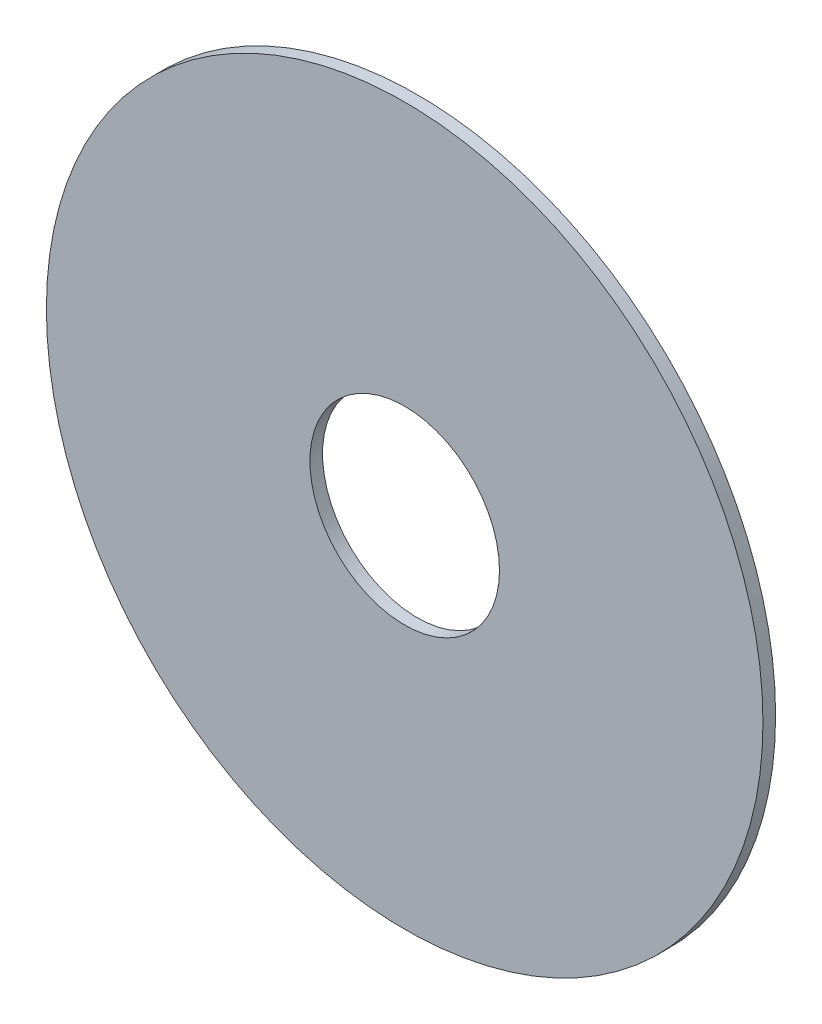
ISO-10303-21;
HEADER;
FILE_DESCRIPTION(('STEP AP214'),'2;1');
FILE_NAME('part.step','',(''),(''),'','','');
FILE_SCHEMA(('AUTOMOTIVE_DESIGN { 1 0 10303 214 1 1 1 1 }'));
ENDSEC;
DATA;
#1=APPLICATION_CONTEXT('core data for automotive mechanical design processes');
#2=APPLICATION_PROTOCOL_DEFINITION('international standard','automotive_design',2000,#1);
#3=PRODUCT_CONTEXT('',#1,'mechanical');
#4=PRODUCT('Part','Part','',(#3));
#5=PRODUCT_RELATED_PRODUCT_CATEGORY('part','',(#4));
#6=PRODUCT_DEFINITION_FORMATION('','',#4);
#7=PRODUCT_DEFINITION_CONTEXT('part definition',#1,'design');
#8=PRODUCT_DEFINITION('design','',#6,#7);
#9=PRODUCT_DEFINITION_SHAPE('','',#8);
#10=(LENGTH_UNIT() NAMED_UNIT(*) SI_UNIT(.MILLI.,.METRE.));
#11=(NAMED_UNIT(*) PLANE_ANGLE_UNIT() SI_UNIT($,.RADIAN.));
#12=(NAMED_UNIT(*) SI_UNIT($,.STERADIAN.) SOLID_ANGLE_UNIT());
#13=UNCERTAINTY_MEASURE_WITH_UNIT(LENGTH_MEASURE(1.E-05),#10,'distance_accuracy_value','');
#14=(GEOMETRIC_REPRESENTATION_CONTEXT(3) GLOBAL_UNCERTAINTY_ASSIGNED_CONTEXT((#13)) GLOBAL_UNIT_ASSIGNED_CONTEXT((#10,
#11,#12)) REPRESENTATION_CONTEXT('',''));
#15=CARTESIAN_POINT('',(0.,0.,0.));
#16=DIRECTION('',(0.,0.,1.));
#17=DIRECTION('',(1.,0.,0.));
#18=AXIS2_PLACEMENT_3D('',#15,#16,#17);
#19=CARTESIAN_POINT('',(0.,0.,1.));
#20=DIRECTION('',(0.,0.,1.));
#21=DIRECTION('',(1.,0.,0.));
#22=AXIS2_PLACEMENT_3D('',#19,#20,#21);
#23=PLANE('',#22);
#24=CARTESIAN_POINT('',(0.,0.,1.));
#25=DIRECTION('',(0.,0.,1.));
#26=DIRECTION('',(1.,0.,0.));
#27=AXIS2_PLACEMENT_3D('',#24,#25,#26);
#28=CIRCLE('',#27,28.35);
#29=CARTESIAN_POINT('',(28.35,0.,1.));
#30=VERTEX_POINT('',#29);
#31=EDGE_CURVE('E10',#30,#30,#28,.T.);
#32=ORIENTED_EDGE('',*,*,#31,.T.);
#33=EDGE_LOOP('',(#32));
#34=FACE_BOUND('',#33,.T.);
#35=CARTESIAN_POINT('',(0.,0.,1.));
#36=DIRECTION('',(0.,0.,1.));
#37=DIRECTION('',(1.,0.,0.));
#38=AXIS2_PLACEMENT_3D('',#35,#36,#37);
#39=CIRCLE('',#38,7.5);
#40=CARTESIAN_POINT('',(7.5,0.,1.));
#41=VERTEX_POINT('',#40);
#42=EDGE_CURVE('E42',#41,#41,#39,.T.);
#43=ORIENTED_EDGE('',*,*,#42,.F.);
#44=EDGE_LOOP('',(#43));
#45=FACE_BOUND('',#44,.T.);
#46=ADVANCED_FACE('F31',(#34,#45),#23,.T.);
#47=CARTESIAN_POINT('',(0.,0.,0.));
#48=DIRECTION('',(0.,0.,1.));
#49=DIRECTION('',(1.,0.,0.));
#50=AXIS2_PLACEMENT_3D('',#47,#48,#49);
#51=PLANE('',#50);
#52=CARTESIAN_POINT('',(0.,0.,0.));
#53=DIRECTION('',(0.,0.,1.));
#54=DIRECTION('',(1.,0.,0.));
#55=AXIS2_PLACEMENT_3D('',#52,#53,#54);
#56=CIRCLE('',#55,28.35);
#57=CARTESIAN_POINT('',(28.35,0.,0.));
#58=VERTEX_POINT('',#57);
#59=EDGE_CURVE('E35',#58,#58,#56,.T.);
#60=ORIENTED_EDGE('',*,*,#59,.F.);
#61=EDGE_LOOP('',(#60));
#62=FACE_BOUND('',#61,.T.);
#63=CARTESIAN_POINT('',(0.,0.,0.));
#64=DIRECTION('',(0.,0.,1.));
#65=DIRECTION('',(1.,0.,0.));
#66=AXIS2_PLACEMENT_3D('',#63,#64,#65);
#67=CIRCLE('',#66,7.5);
#68=CARTESIAN_POINT('',(7.5,0.,0.));
#69=VERTEX_POINT('',#68);
#70=EDGE_CURVE('E44',#69,#69,#67,.T.);
#71=ORIENTED_EDGE('',*,*,#70,.T.);
#72=EDGE_LOOP('',(#71));
#73=FACE_BOUND('',#72,.T.);
#74=ADVANCED_FACE('F54',(#62,#73),#51,.F.);
#75=CARTESIAN_POINT('',(0.,0.,1.));
#76=DIRECTION('',(0.,0.,-1.));
#77=DIRECTION('',(-1.,0.,0.));
#78=AXIS2_PLACEMENT_3D('',#75,#76,#77);
#79=CYLINDRICAL_SURFACE('',#78,28.35);
#80=ORIENTED_EDGE('',*,*,#31,.F.);
#81=EDGE_LOOP('',(#80));
#82=FACE_BOUND('',#81,.T.);
#83=ORIENTED_EDGE('',*,*,#59,.T.);
#84=EDGE_LOOP('',(#83));
#85=FACE_BOUND('',#84,.T.);
#86=ADVANCED_FACE('F33',(#82,#85),#79,.T.);
#87=CARTESIAN_POINT('',(0.,0.,1.));
#88=DIRECTION('',(0.,0.,-1.));
#89=DIRECTION('',(-1.,0.,0.));
#90=AXIS2_PLACEMENT_3D('',#87,#88,#89);
#91=CYLINDRICAL_SURFACE('',#90,7.5);
#92=ORIENTED_EDGE('',*,*,#42,.T.);
#93=EDGE_LOOP('',(#92));
#94=FACE_BOUND('',#93,.T.);
#95=ORIENTED_EDGE('',*,*,#70,.F.);
#96=EDGE_LOOP('',(#95));
#97=FACE_BOUND('',#96,.T.);
#98=ADVANCED_FACE('F50',(#94,#97),#91,.F.);
#99=CLOSED_SHELL('',(#46,#74,#86,#98));
#100=MANIFOLD_SOLID_BREP('B2',#99);
#101=ADVANCED_BREP_SHAPE_REPRESENTATION('',(#18,#100),#14);
#102=SHAPE_DEFINITION_REPRESENTATION(#9,#101);
ENDSEC;
END-ISO-10303-21;
